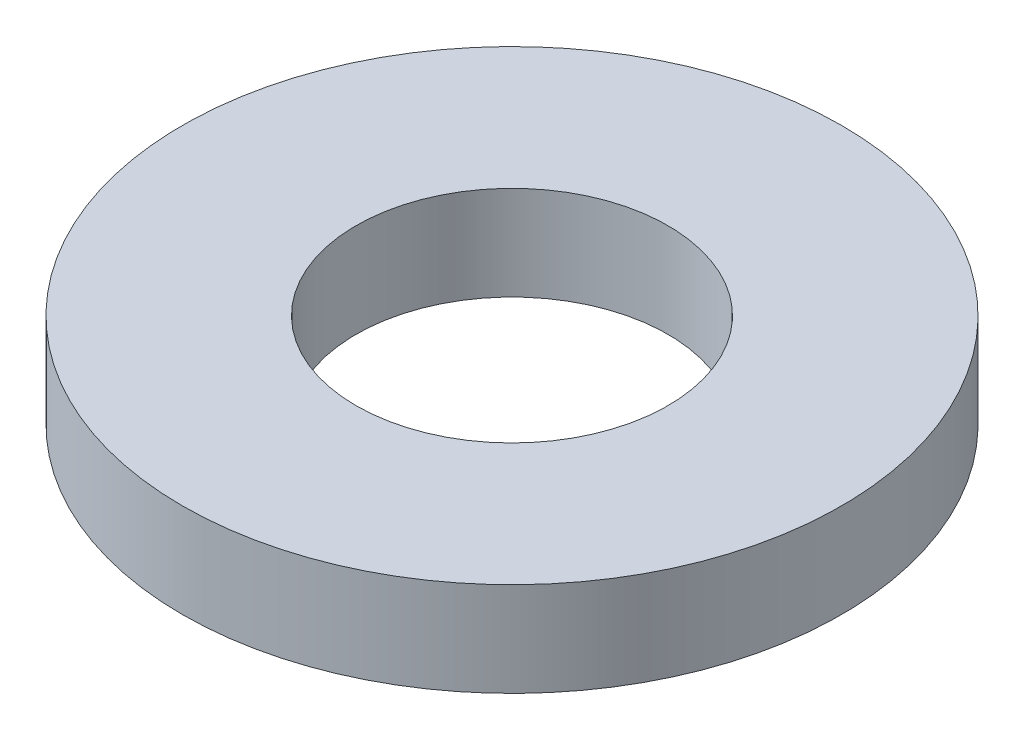
ISO-10303-21;
HEADER;
FILE_DESCRIPTION(('STEP AP214'),'2;1');
FILE_NAME('part.step','',(''),(''),'','','');
FILE_SCHEMA(('AUTOMOTIVE_DESIGN { 1 0 10303 214 1 1 1 1 }'));
ENDSEC;
DATA;
#1=APPLICATION_CONTEXT('core data for automotive mechanical design processes');
#2=APPLICATION_PROTOCOL_DEFINITION('international standard','automotive_design',2000,#1);
#3=PRODUCT_CONTEXT('',#1,'mechanical');
#4=PRODUCT('Part','Part','',(#3));
#5=PRODUCT_RELATED_PRODUCT_CATEGORY('part','',(#4));
#6=PRODUCT_DEFINITION_FORMATION('','',#4);
#7=PRODUCT_DEFINITION_CONTEXT('part definition',#1,'design');
#8=PRODUCT_DEFINITION('design','',#6,#7);
#9=PRODUCT_DEFINITION_SHAPE('','',#8);
#10=(LENGTH_UNIT() NAMED_UNIT(*) SI_UNIT(.MILLI.,.METRE.));
#11=(NAMED_UNIT(*) PLANE_ANGLE_UNIT() SI_UNIT($,.RADIAN.));
#12=(NAMED_UNIT(*) SI_UNIT($,.STERADIAN.) SOLID_ANGLE_UNIT());
#13=UNCERTAINTY_MEASURE_WITH_UNIT(LENGTH_MEASURE(1.E-05),#10,'distance_accuracy_value','');
#14=(GEOMETRIC_REPRESENTATION_CONTEXT(3) GLOBAL_UNCERTAINTY_ASSIGNED_CONTEXT((#13)) GLOBAL_UNIT_ASSIGNED_CONTEXT((#10,
#11,#12)) REPRESENTATION_CONTEXT('',''));
#15=CARTESIAN_POINT('',(0.,0.,0.));
#16=DIRECTION('',(0.,0.,1.));
#17=DIRECTION('',(1.,0.,0.));
#18=AXIS2_PLACEMENT_3D('',#15,#16,#17);
#19=CARTESIAN_POINT('',(0.,39.6766832836276,0.));
#20=DIRECTION('',(0.,1.,0.));
#21=DIRECTION('',(0.,0.,1.));
#22=AXIS2_PLACEMENT_3D('',#19,#20,#21);
#23=CYLINDRICAL_SURFACE('',#22,1.325);
#24=CARTESIAN_POINT('',(0.,0.326881720430106,0.));
#25=DIRECTION('',(0.,1.,0.));
#26=DIRECTION('',(0.,0.,1.));
#27=AXIS2_PLACEMENT_3D('',#24,#25,#26);
#28=CIRCLE('',#27,1.325);
#29=CARTESIAN_POINT('',(0.,0.326881720430106,1.325));
#30=VERTEX_POINT('',#29);
#31=EDGE_CURVE('E10',#30,#30,#28,.T.);
#32=ORIENTED_EDGE('',*,*,#31,.F.);
#33=EDGE_LOOP('',(#32));
#34=FACE_BOUND('',#33,.T.);
#35=CARTESIAN_POINT('',(0.,1.12688172043011,0.));
#36=DIRECTION('',(0.,1.,0.));
#37=DIRECTION('',(0.,0.,1.));
#38=AXIS2_PLACEMENT_3D('',#35,#36,#37);
#39=CIRCLE('',#38,1.325);
#40=CARTESIAN_POINT('',(0.,1.12688172043011,1.325));
#41=VERTEX_POINT('',#40);
#42=EDGE_CURVE('E47',#41,#41,#39,.T.);
#43=ORIENTED_EDGE('',*,*,#42,.T.);
#44=EDGE_LOOP('',(#43));
#45=FACE_BOUND('',#44,.T.);
#46=ADVANCED_FACE('F33',(#34,#45),#23,.F.);
#47=CARTESIAN_POINT('',(0.,0.326881720430107,-1.325));
#48=DIRECTION('',(0.,1.,0.));
#49=DIRECTION('',(0.,0.,1.));
#50=AXIS2_PLACEMENT_3D('',#47,#48,#49);
#51=PLANE('',#50);
#52=CARTESIAN_POINT('',(0.,0.326881720430106,0.));
#53=DIRECTION('',(0.,1.,0.));
#54=DIRECTION('',(0.,0.,1.));
#55=AXIS2_PLACEMENT_3D('',#52,#53,#54);
#56=CIRCLE('',#55,2.8);
#57=CARTESIAN_POINT('',(0.,0.326881720430106,2.8));
#58=VERTEX_POINT('',#57);
#59=EDGE_CURVE('E39',#58,#58,#56,.T.);
#60=ORIENTED_EDGE('',*,*,#59,.F.);
#61=EDGE_LOOP('',(#60));
#62=FACE_BOUND('',#61,.T.);
#63=ORIENTED_EDGE('',*,*,#31,.T.);
#64=EDGE_LOOP('',(#63));
#65=FACE_BOUND('',#64,.T.);
#66=ADVANCED_FACE('F62',(#62,#65),#51,.F.);
#67=CARTESIAN_POINT('',(0.,39.6766832836276,0.));
#68=DIRECTION('',(0.,1.,0.));
#69=DIRECTION('',(0.,0.,1.));
#70=AXIS2_PLACEMENT_3D('',#67,#68,#69);
#71=CYLINDRICAL_SURFACE('',#70,2.8);
#72=CARTESIAN_POINT('',(0.,1.12688172043011,0.));
#73=DIRECTION('',(0.,1.,0.));
#74=DIRECTION('',(0.,0.,1.));
#75=AXIS2_PLACEMENT_3D('',#72,#73,#74);
#76=CIRCLE('',#75,2.8);
#77=CARTESIAN_POINT('',(0.,1.12688172043011,2.8));
#78=VERTEX_POINT('',#77);
#79=EDGE_CURVE('E43',#78,#78,#76,.T.);
#80=ORIENTED_EDGE('',*,*,#79,.F.);
#81=EDGE_LOOP('',(#80));
#82=FACE_BOUND('',#81,.T.);
#83=ORIENTED_EDGE('',*,*,#59,.T.);
#84=EDGE_LOOP('',(#83));
#85=FACE_BOUND('',#84,.T.);
#86=ADVANCED_FACE('F57',(#82,#85),#71,.T.);
#87=CARTESIAN_POINT('',(0.,1.12688172043011,-1.325));
#88=DIRECTION('',(0.,-1.,0.));
#89=DIRECTION('',(0.,0.,-1.));
#90=AXIS2_PLACEMENT_3D('',#87,#88,#89);
#91=PLANE('',#90);
#92=ORIENTED_EDGE('',*,*,#42,.F.);
#93=EDGE_LOOP('',(#92));
#94=FACE_BOUND('',#93,.T.);
#95=ORIENTED_EDGE('',*,*,#79,.T.);
#96=EDGE_LOOP('',(#95));
#97=FACE_BOUND('',#96,.T.);
#98=ADVANCED_FACE('F54',(#94,#97),#91,.F.);
#99=CLOSED_SHELL('',(#46,#66,#86,#98));
#100=MANIFOLD_SOLID_BREP('B2',#99);
#101=ADVANCED_BREP_SHAPE_REPRESENTATION('',(#18,#100),#14);
#102=SHAPE_DEFINITION_REPRESENTATION(#9,#101);
ENDSEC;
END-ISO-10303-21;
